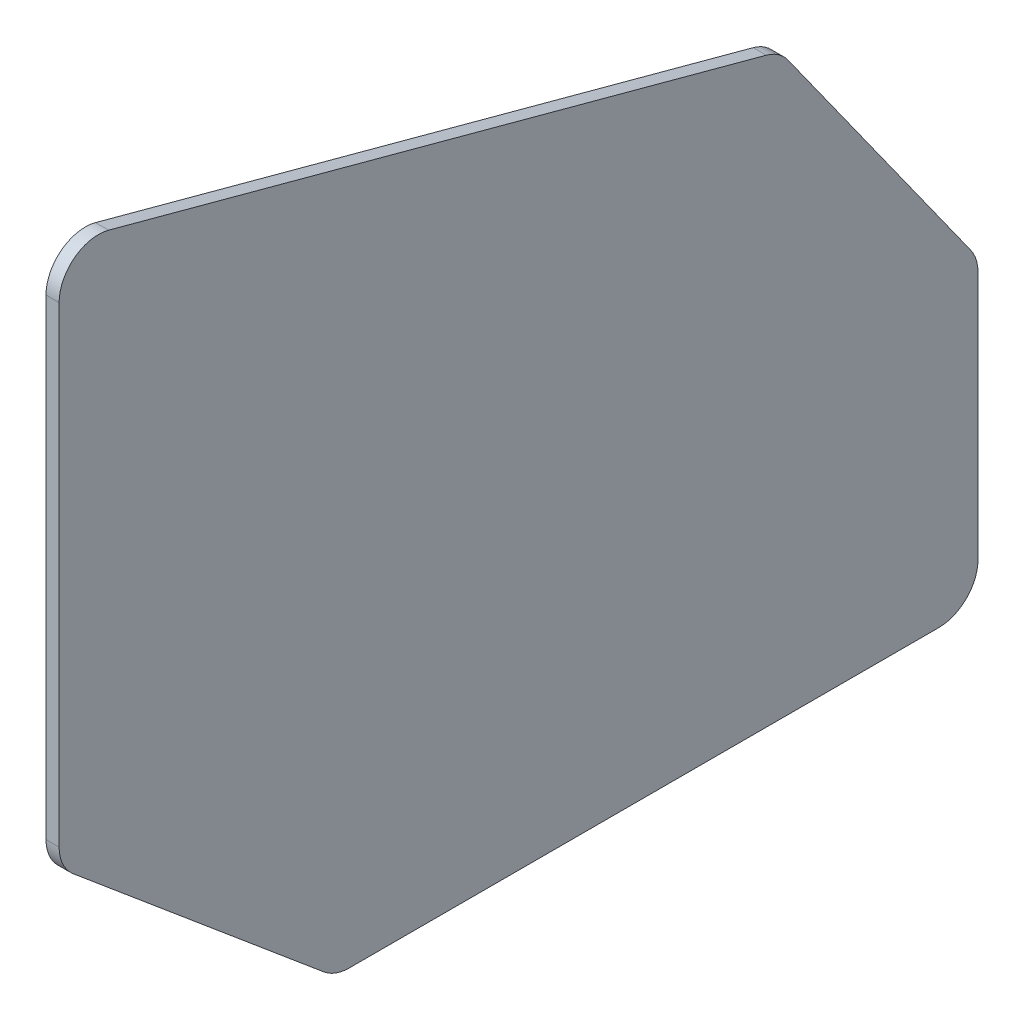
ISO-10303-21;
HEADER;
FILE_DESCRIPTION(('STEP AP214'),'2;1');
FILE_NAME('part.step','',(''),(''),'','','');
FILE_SCHEMA(('AUTOMOTIVE_DESIGN { 1 0 10303 214 1 1 1 1 }'));
ENDSEC;
DATA;
#1=APPLICATION_CONTEXT('core data for automotive mechanical design processes');
#2=APPLICATION_PROTOCOL_DEFINITION('international standard','automotive_design',2000,#1);
#3=PRODUCT_CONTEXT('',#1,'mechanical');
#4=PRODUCT('Part','Part','',(#3));
#5=PRODUCT_RELATED_PRODUCT_CATEGORY('part','',(#4));
#6=PRODUCT_DEFINITION_FORMATION('','',#4);
#7=PRODUCT_DEFINITION_CONTEXT('part definition',#1,'design');
#8=PRODUCT_DEFINITION('design','',#6,#7);
#9=PRODUCT_DEFINITION_SHAPE('','',#8);
#10=(LENGTH_UNIT() NAMED_UNIT(*) SI_UNIT(.MILLI.,.METRE.));
#11=(NAMED_UNIT(*) PLANE_ANGLE_UNIT() SI_UNIT($,.RADIAN.));
#12=(NAMED_UNIT(*) SI_UNIT($,.STERADIAN.) SOLID_ANGLE_UNIT());
#13=UNCERTAINTY_MEASURE_WITH_UNIT(LENGTH_MEASURE(1.E-05),#10,'distance_accuracy_value','');
#14=(GEOMETRIC_REPRESENTATION_CONTEXT(3) GLOBAL_UNCERTAINTY_ASSIGNED_CONTEXT((#13)) GLOBAL_UNIT_ASSIGNED_CONTEXT((#10,
#11,#12)) REPRESENTATION_CONTEXT('',''));
#15=CARTESIAN_POINT('',(0.,0.,0.));
#16=DIRECTION('',(0.,0.,1.));
#17=DIRECTION('',(1.,0.,0.));
#18=AXIS2_PLACEMENT_3D('',#15,#16,#17);
#19=CARTESIAN_POINT('',(10.,-174.517122226006,-532.073894018374));
#20=DIRECTION('',(-1.,0.,0.));
#21=DIRECTION('',(0.,0.,1.));
#22=AXIS2_PLACEMENT_3D('',#19,#20,#21);
#23=CYLINDRICAL_SURFACE('',#22,30.0000000000001);
#24=CARTESIAN_POINT('',(0.,-174.517122226006,-532.073894018374));
#25=DIRECTION('',(1.,0.,0.));
#26=DIRECTION('',(0.,0.,1.));
#27=AXIS2_PLACEMENT_3D('',#24,#25,#26);
#28=CIRCLE('',#27,30.0000000000001);
#29=CARTESIAN_POINT('',(0.,-157.087470130835,-556.491249072542));
#30=VERTEX_POINT('',#29);
#31=CARTESIAN_POINT('',(0.,-145.551320648023,-539.883012979237));
#32=VERTEX_POINT('',#31);
#33=EDGE_CURVE('E402',#30,#32,#28,.T.);
#34=ORIENTED_EDGE('',*,*,#33,.T.);
#35=DIRECTION('',(-1.,0.,0.));
#36=VECTOR('',#35,1.);
#37=CARTESIAN_POINT('',(10.,-145.551320648023,-539.883012979237));
#38=LINE('',#37,#36);
#39=CARTESIAN_POINT('',(10.,-145.551320648023,-539.883012979237));
#40=VERTEX_POINT('',#39);
#41=EDGE_CURVE('E11',#40,#32,#38,.T.);
#42=ORIENTED_EDGE('',*,*,#41,.F.);
#43=CARTESIAN_POINT('',(10.,-174.517122226006,-532.073894018374));
#44=DIRECTION('',(1.,0.,0.));
#45=DIRECTION('',(0.,0.,1.));
#46=AXIS2_PLACEMENT_3D('',#43,#44,#45);
#47=CIRCLE('',#46,30.0000000000001);
#48=CARTESIAN_POINT('',(10.,-157.087470130835,-556.491249072542));
#49=VERTEX_POINT('',#48);
#50=EDGE_CURVE('E442',#49,#40,#47,.T.);
#51=ORIENTED_EDGE('',*,*,#50,.F.);
#52=DIRECTION('',(-1.,0.,0.));
#53=VECTOR('',#52,1.);
#54=CARTESIAN_POINT('',(10.,-157.087470130835,-556.491249072542));
#55=LINE('',#54,#53);
#56=EDGE_CURVE('E443',#49,#30,#55,.T.);
#57=ORIENTED_EDGE('',*,*,#56,.T.);
#58=EDGE_LOOP('',(#34,#42,#51,#57));
#59=FACE_BOUND('',#58,.T.);
#60=ADVANCED_FACE('F39',(#59),#23,.T.);
#61=CARTESIAN_POINT('',(10.,-145.551320648023,-539.883012979237));
#62=DIRECTION('',(0.,-0.965526719266104,0.260303965362101));
#63=DIRECTION('',(0.,-0.260303965362101,-0.965526719266104));
#64=AXIS2_PLACEMENT_3D('',#61,#62,#63);
#65=PLANE('',#64);
#66=DIRECTION('',(0.,0.260303965362101,0.965526719266104));
#67=VECTOR('',#66,1.);
#68=CARTESIAN_POINT('',(0.,-145.551320648023,-539.883012979237));
#69=LINE('',#68,#67);
#70=CARTESIAN_POINT('',(0.,-10.1932586597301,-37.8091189608631));
#71=VERTEX_POINT('',#70);
#72=EDGE_CURVE('E392',#32,#71,#69,.T.);
#73=ORIENTED_EDGE('',*,*,#72,.T.);
#74=DIRECTION('',(-1.,0.,0.));
#75=VECTOR('',#74,1.);
#76=CARTESIAN_POINT('',(10.,-10.1932586597301,-37.8091189608631));
#77=LINE('',#76,#75);
#78=CARTESIAN_POINT('',(10.,-10.1932586597301,-37.8091189608631));
#79=VERTEX_POINT('',#78);
#80=EDGE_CURVE('E47',#79,#71,#77,.T.);
#81=ORIENTED_EDGE('',*,*,#80,.F.);
#82=DIRECTION('',(0.,0.260303965362101,0.965526719266104));
#83=VECTOR('',#82,1.);
#84=CARTESIAN_POINT('',(10.,-145.551320648023,-539.883012979237));
#85=LINE('',#84,#83);
#86=EDGE_CURVE('E492',#40,#79,#85,.T.);
#87=ORIENTED_EDGE('',*,*,#86,.F.);
#88=ORIENTED_EDGE('',*,*,#41,.T.);
#89=EDGE_LOOP('',(#73,#81,#87,#88));
#90=FACE_BOUND('',#89,.T.);
#91=ADVANCED_FACE('F383',(#90),#65,.F.);
#92=CARTESIAN_POINT('',(10.,-39.1590602377132,-30.));
#93=DIRECTION('',(-1.,0.,0.));
#94=DIRECTION('',(0.,0.,1.));
#95=AXIS2_PLACEMENT_3D('',#92,#93,#94);
#96=CYLINDRICAL_SURFACE('',#95,30.);
#97=CARTESIAN_POINT('',(0.,-39.1590602377132,-30.));
#98=DIRECTION('',(1.,0.,0.));
#99=DIRECTION('',(0.,0.,1.));
#100=AXIS2_PLACEMENT_3D('',#97,#98,#99);
#101=CIRCLE('',#100,30.);
#102=CARTESIAN_POINT('',(0.,-39.1590602377132,0.));
#103=VERTEX_POINT('',#102);
#104=EDGE_CURVE('E401',#71,#103,#101,.T.);
#105=ORIENTED_EDGE('',*,*,#104,.T.);
#106=DIRECTION('',(-1.,0.,0.));
#107=VECTOR('',#106,1.);
#108=CARTESIAN_POINT('',(10.,-39.1590602377132,0.));
#109=LINE('',#108,#107);
#110=CARTESIAN_POINT('',(10.,-39.1590602377132,0.));
#111=VERTEX_POINT('',#110);
#112=EDGE_CURVE('E408',#111,#103,#109,.T.);
#113=ORIENTED_EDGE('',*,*,#112,.F.);
#114=CARTESIAN_POINT('',(10.,-39.1590602377132,-30.));
#115=DIRECTION('',(1.,0.,0.));
#116=DIRECTION('',(0.,0.,1.));
#117=AXIS2_PLACEMENT_3D('',#114,#115,#116);
#118=CIRCLE('',#117,30.);
#119=EDGE_CURVE('E406',#79,#111,#118,.T.);
#120=ORIENTED_EDGE('',*,*,#119,.F.);
#121=ORIENTED_EDGE('',*,*,#80,.T.);
#122=EDGE_LOOP('',(#105,#113,#120,#121));
#123=FACE_BOUND('',#122,.T.);
#124=ADVANCED_FACE('F380',(#123),#96,.T.);
#125=CARTESIAN_POINT('',(10.,-39.1590602377132,0.));
#126=DIRECTION('',(0.,0.,-1.));
#127=DIRECTION('',(0.,1.,0.));
#128=AXIS2_PLACEMENT_3D('',#125,#126,#127);
#129=PLANE('',#128);
#130=DIRECTION('',(0.,-1.,0.));
#131=VECTOR('',#130,1.);
#132=CARTESIAN_POINT('',(0.,-39.1590602377132,0.));
#133=LINE('',#132,#131);
#134=CARTESIAN_POINT('',(0.,-399.159060237713,0.));
#135=VERTEX_POINT('',#134);
#136=EDGE_CURVE('E411',#103,#135,#133,.T.);
#137=ORIENTED_EDGE('',*,*,#136,.T.);
#138=DIRECTION('',(-1.,0.,0.));
#139=VECTOR('',#138,1.);
#140=CARTESIAN_POINT('',(10.,-399.159060237713,0.));
#141=LINE('',#140,#139);
#142=CARTESIAN_POINT('',(10.,-399.159060237713,0.));
#143=VERTEX_POINT('',#142);
#144=EDGE_CURVE('E476',#143,#135,#141,.T.);
#145=ORIENTED_EDGE('',*,*,#144,.F.);
#146=DIRECTION('',(0.,-1.,0.));
#147=VECTOR('',#146,1.);
#148=CARTESIAN_POINT('',(10.,-39.1590602377132,0.));
#149=LINE('',#148,#147);
#150=EDGE_CURVE('E483',#111,#143,#149,.T.);
#151=ORIENTED_EDGE('',*,*,#150,.F.);
#152=ORIENTED_EDGE('',*,*,#112,.T.);
#153=EDGE_LOOP('',(#137,#145,#151,#152));
#154=FACE_BOUND('',#153,.T.);
#155=ADVANCED_FACE('F376',(#154),#129,.F.);
#156=CARTESIAN_POINT('',(10.,-399.159060237713,-29.9999999999999));
#157=DIRECTION('',(-1.,0.,0.));
#158=DIRECTION('',(0.,0.,1.));
#159=AXIS2_PLACEMENT_3D('',#156,#157,#158);
#160=CYLINDRICAL_SURFACE('',#159,30.);
#161=CARTESIAN_POINT('',(0.,-399.159060237713,-29.9999999999999));
#162=DIRECTION('',(1.,0.,0.));
#163=DIRECTION('',(0.,0.,1.));
#164=AXIS2_PLACEMENT_3D('',#161,#162,#163);
#165=CIRCLE('',#164,30.);
#166=CARTESIAN_POINT('',(0.,-422.140393531283,-10.7163717094038));
#167=VERTEX_POINT('',#166);
#168=EDGE_CURVE('E415',#135,#167,#165,.T.);
#169=ORIENTED_EDGE('',*,*,#168,.T.);
#170=DIRECTION('',(-1.,0.,0.));
#171=VECTOR('',#170,1.);
#172=CARTESIAN_POINT('',(10.,-422.140393531283,-10.7163717094038));
#173=LINE('',#172,#171);
#174=CARTESIAN_POINT('',(10.,-422.140393531283,-10.7163717094038));
#175=VERTEX_POINT('',#174);
#176=EDGE_CURVE('E472',#175,#167,#173,.T.);
#177=ORIENTED_EDGE('',*,*,#176,.F.);
#178=CARTESIAN_POINT('',(10.,-399.159060237713,-29.9999999999999));
#179=DIRECTION('',(1.,0.,0.));
#180=DIRECTION('',(0.,0.,1.));
#181=AXIS2_PLACEMENT_3D('',#178,#179,#180);
#182=CIRCLE('',#181,30.);
#183=EDGE_CURVE('E486',#143,#175,#182,.T.);
#184=ORIENTED_EDGE('',*,*,#183,.F.);
#185=ORIENTED_EDGE('',*,*,#144,.T.);
#186=EDGE_LOOP('',(#169,#177,#184,#185));
#187=FACE_BOUND('',#186,.T.);
#188=ADVANCED_FACE('F372',(#187),#160,.T.);
#189=CARTESIAN_POINT('',(10.,-422.140393531283,-10.7163717094038));
#190=DIRECTION('',(0.,0.76604444311898,-0.642787609686537));
#191=DIRECTION('',(0.,0.642787609686537,0.76604444311898));
#192=AXIS2_PLACEMENT_3D('',#189,#190,#191);
#193=PLANE('',#192);
#194=DIRECTION('',(0.,-0.642787609686537,-0.76604444311898));
#195=VECTOR('',#194,1.);
#196=CARTESIAN_POINT('',(0.,-422.140393531283,-10.7163717094038));
#197=LINE('',#196,#195);
#198=CARTESIAN_POINT('',(0.,-582.837295952917,-202.227482489149));
#199=VERTEX_POINT('',#198);
#200=EDGE_CURVE('E421',#167,#199,#197,.T.);
#201=ORIENTED_EDGE('',*,*,#200,.T.);
#202=DIRECTION('',(-1.,0.,0.));
#203=VECTOR('',#202,1.);
#204=CARTESIAN_POINT('',(10.,-582.837295952917,-202.227482489149));
#205=LINE('',#204,#203);
#206=CARTESIAN_POINT('',(10.,-582.837295952917,-202.227482489149));
#207=VERTEX_POINT('',#206);
#208=EDGE_CURVE('E468',#207,#199,#205,.T.);
#209=ORIENTED_EDGE('',*,*,#208,.F.);
#210=DIRECTION('',(0.,-0.642787609686537,-0.76604444311898));
#211=VECTOR('',#210,1.);
#212=CARTESIAN_POINT('',(10.,-422.140393531283,-10.7163717094038));
#213=LINE('',#212,#211);
#214=EDGE_CURVE('E490',#175,#207,#213,.T.);
#215=ORIENTED_EDGE('',*,*,#214,.F.);
#216=ORIENTED_EDGE('',*,*,#176,.T.);
#217=EDGE_LOOP('',(#201,#209,#215,#216));
#218=FACE_BOUND('',#217,.T.);
#219=ADVANCED_FACE('F368',(#218),#193,.F.);
#220=CARTESIAN_POINT('',(10.,-559.855962659348,-221.511110779745));
#221=DIRECTION('',(-1.,0.,0.));
#222=DIRECTION('',(0.,0.,1.));
#223=AXIS2_PLACEMENT_3D('',#220,#221,#222);
#224=CYLINDRICAL_SURFACE('',#223,30.);
#225=CARTESIAN_POINT('',(0.,-559.855962659348,-221.511110779745));
#226=DIRECTION('',(1.,0.,0.));
#227=DIRECTION('',(0.,0.,1.));
#228=AXIS2_PLACEMENT_3D('',#225,#226,#227);
#229=CIRCLE('',#228,30.);
#230=CARTESIAN_POINT('',(0.,-589.855962659348,-221.511110779745));
#231=VERTEX_POINT('',#230);
#232=EDGE_CURVE('E424',#199,#231,#229,.T.);
#233=ORIENTED_EDGE('',*,*,#232,.T.);
#234=DIRECTION('',(-1.,0.,0.));
#235=VECTOR('',#234,1.);
#236=CARTESIAN_POINT('',(10.,-589.855962659348,-221.511110779745));
#237=LINE('',#236,#235);
#238=CARTESIAN_POINT('',(10.,-589.855962659348,-221.511110779745));
#239=VERTEX_POINT('',#238);
#240=EDGE_CURVE('E464',#239,#231,#237,.T.);
#241=ORIENTED_EDGE('',*,*,#240,.F.);
#242=CARTESIAN_POINT('',(10.,-559.855962659348,-221.511110779745));
#243=DIRECTION('',(1.,0.,0.));
#244=DIRECTION('',(0.,0.,1.));
#245=AXIS2_PLACEMENT_3D('',#242,#243,#244);
#246=CIRCLE('',#245,30.);
#247=EDGE_CURVE('E498',#207,#239,#246,.T.);
#248=ORIENTED_EDGE('',*,*,#247,.F.);
#249=ORIENTED_EDGE('',*,*,#208,.T.);
#250=EDGE_LOOP('',(#233,#241,#248,#249));
#251=FACE_BOUND('',#250,.T.);
#252=ADVANCED_FACE('F364',(#251),#224,.T.);
#253=CARTESIAN_POINT('',(10.,-589.855962659348,-221.511110779745));
#254=DIRECTION('',(0.,1.,0.));
#255=DIRECTION('',(0.,0.,1.));
#256=AXIS2_PLACEMENT_3D('',#253,#254,#255);
#257=PLANE('',#256);
#258=DIRECTION('',(0.,0.,-1.));
#259=VECTOR('',#258,1.);
#260=CARTESIAN_POINT('',(0.,-589.855962659348,-221.511110779745));
#261=LINE('',#260,#259);
#262=CARTESIAN_POINT('',(0.,-589.855962659348,-671.511110779745));
#263=VERTEX_POINT('',#262);
#264=EDGE_CURVE('E427',#231,#263,#261,.T.);
#265=ORIENTED_EDGE('',*,*,#264,.T.);
#266=DIRECTION('',(-1.,0.,0.));
#267=VECTOR('',#266,1.);
#268=CARTESIAN_POINT('',(10.,-589.855962659348,-671.511110779745));
#269=LINE('',#268,#267);
#270=CARTESIAN_POINT('',(10.,-589.855962659348,-671.511110779745));
#271=VERTEX_POINT('',#270);
#272=EDGE_CURVE('E460',#271,#263,#269,.T.);
#273=ORIENTED_EDGE('',*,*,#272,.F.);
#274=DIRECTION('',(0.,0.,-1.));
#275=VECTOR('',#274,1.);
#276=CARTESIAN_POINT('',(10.,-589.855962659348,-221.511110779745));
#277=LINE('',#276,#275);
#278=EDGE_CURVE('E501',#239,#271,#277,.T.);
#279=ORIENTED_EDGE('',*,*,#278,.F.);
#280=ORIENTED_EDGE('',*,*,#240,.T.);
#281=EDGE_LOOP('',(#265,#273,#279,#280));
#282=FACE_BOUND('',#281,.T.);
#283=ADVANCED_FACE('F360',(#282),#257,.F.);
#284=CARTESIAN_POINT('',(10.,-559.855962659348,-671.511110779745));
#285=DIRECTION('',(-1.,0.,0.));
#286=DIRECTION('',(0.,0.,1.));
#287=AXIS2_PLACEMENT_3D('',#284,#285,#286);
#288=CYLINDRICAL_SURFACE('',#287,30.0000000000001);
#289=CARTESIAN_POINT('',(0.,-559.855962659348,-671.511110779745));
#290=DIRECTION('',(1.,0.,0.));
#291=DIRECTION('',(0.,0.,1.));
#292=AXIS2_PLACEMENT_3D('',#289,#290,#291);
#293=CIRCLE('',#292,30.0000000000001);
#294=CARTESIAN_POINT('',(0.,-559.855962659348,-701.511110779745));
#295=VERTEX_POINT('',#294);
#296=EDGE_CURVE('E430',#263,#295,#293,.T.);
#297=ORIENTED_EDGE('',*,*,#296,.T.);
#298=DIRECTION('',(-1.,0.,0.));
#299=VECTOR('',#298,1.);
#300=CARTESIAN_POINT('',(10.,-559.855962659348,-701.511110779745));
#301=LINE('',#300,#299);
#302=CARTESIAN_POINT('',(10.,-559.855962659348,-701.511110779745));
#303=VERTEX_POINT('',#302);
#304=EDGE_CURVE('E456',#303,#295,#301,.T.);
#305=ORIENTED_EDGE('',*,*,#304,.F.);
#306=CARTESIAN_POINT('',(10.,-559.855962659348,-671.511110779745));
#307=DIRECTION('',(1.,0.,0.));
#308=DIRECTION('',(0.,0.,1.));
#309=AXIS2_PLACEMENT_3D('',#306,#307,#308);
#310=CIRCLE('',#309,30.0000000000001);
#311=EDGE_CURVE('E504',#271,#303,#310,.T.);
#312=ORIENTED_EDGE('',*,*,#311,.F.);
#313=ORIENTED_EDGE('',*,*,#272,.T.);
#314=EDGE_LOOP('',(#297,#305,#312,#313));
#315=FACE_BOUND('',#314,.T.);
#316=ADVANCED_FACE('F356',(#315),#288,.T.);
#317=CARTESIAN_POINT('',(10.,-559.855962659348,-701.511110779745));
#318=DIRECTION('',(0.,0.,1.));
#319=DIRECTION('',(0.,-1.,0.));
#320=AXIS2_PLACEMENT_3D('',#317,#318,#319);
#321=PLANE('',#320);
#322=DIRECTION('',(0.,1.,0.));
#323=VECTOR('',#322,1.);
#324=CARTESIAN_POINT('',(0.,-559.855962659348,-701.511110779745));
#325=LINE('',#324,#323);
#326=CARTESIAN_POINT('',(0.,-369.855962659348,-701.511110779745));
#327=VERTEX_POINT('',#326);
#328=EDGE_CURVE('E433',#295,#327,#325,.T.);
#329=ORIENTED_EDGE('',*,*,#328,.T.);
#330=DIRECTION('',(-1.,0.,0.));
#331=VECTOR('',#330,1.);
#332=CARTESIAN_POINT('',(10.,-369.855962659348,-701.511110779745));
#333=LINE('',#332,#331);
#334=CARTESIAN_POINT('',(10.,-369.855962659348,-701.511110779745));
#335=VERTEX_POINT('',#334);
#336=EDGE_CURVE('E452',#335,#327,#333,.T.);
#337=ORIENTED_EDGE('',*,*,#336,.F.);
#338=DIRECTION('',(0.,1.,0.));
#339=VECTOR('',#338,1.);
#340=CARTESIAN_POINT('',(10.,-559.855962659348,-701.511110779745));
#341=LINE('',#340,#339);
#342=EDGE_CURVE('E507',#303,#335,#341,.T.);
#343=ORIENTED_EDGE('',*,*,#342,.F.);
#344=ORIENTED_EDGE('',*,*,#304,.T.);
#345=EDGE_LOOP('',(#329,#337,#343,#344));
#346=FACE_BOUND('',#345,.T.);
#347=ADVANCED_FACE('F352',(#346),#321,.F.);
#348=CARTESIAN_POINT('',(10.,-369.855962659348,-671.511110779745));
#349=DIRECTION('',(-1.,0.,0.));
#350=DIRECTION('',(0.,0.,1.));
#351=AXIS2_PLACEMENT_3D('',#348,#349,#350);
#352=CYLINDRICAL_SURFACE('',#351,30.);
#353=CARTESIAN_POINT('',(0.,-369.855962659348,-671.511110779745));
#354=DIRECTION('',(1.,0.,0.));
#355=DIRECTION('',(0.,0.,1.));
#356=AXIS2_PLACEMENT_3D('',#353,#354,#355);
#357=CIRCLE('',#356,30.);
#358=CARTESIAN_POINT('',(0.,-352.426310564176,-695.928465833913));
#359=VERTEX_POINT('',#358);
#360=EDGE_CURVE('E436',#327,#359,#357,.T.);
#361=ORIENTED_EDGE('',*,*,#360,.T.);
#362=DIRECTION('',(-1.,0.,0.));
#363=VECTOR('',#362,1.);
#364=CARTESIAN_POINT('',(10.,-352.426310564176,-695.928465833913));
#365=LINE('',#364,#363);
#366=CARTESIAN_POINT('',(10.,-352.426310564176,-695.928465833913));
#367=VERTEX_POINT('',#366);
#368=EDGE_CURVE('E447',#367,#359,#365,.T.);
#369=ORIENTED_EDGE('',*,*,#368,.F.);
#370=CARTESIAN_POINT('',(10.,-369.855962659348,-671.511110779745));
#371=DIRECTION('',(1.,0.,0.));
#372=DIRECTION('',(0.,0.,1.));
#373=AXIS2_PLACEMENT_3D('',#370,#371,#372);
#374=CIRCLE('',#373,30.);
#375=EDGE_CURVE('E510',#335,#367,#374,.T.);
#376=ORIENTED_EDGE('',*,*,#375,.F.);
#377=ORIENTED_EDGE('',*,*,#336,.T.);
#378=EDGE_LOOP('',(#361,#369,#376,#377));
#379=FACE_BOUND('',#378,.T.);
#380=ADVANCED_FACE('F348',(#379),#352,.T.);
#381=CARTESIAN_POINT('',(10.,-352.426310564176,-695.928465833913));
#382=DIRECTION('',(0.,-0.580988403172377,0.813911835138924));
#383=DIRECTION('',(0.,-0.813911835138924,-0.580988403172377));
#384=AXIS2_PLACEMENT_3D('',#381,#382,#383);
#385=PLANE('',#384);
#386=DIRECTION('',(0.,0.813911835138924,0.580988403172377));
#387=VECTOR('',#386,1.);
#388=CARTESIAN_POINT('',(0.,-352.426310564176,-695.928465833913));
#389=LINE('',#388,#387);
#390=EDGE_CURVE('E439',#359,#30,#389,.T.);
#391=ORIENTED_EDGE('',*,*,#390,.T.);
#392=ORIENTED_EDGE('',*,*,#56,.F.);
#393=DIRECTION('',(0.,0.813911835138924,0.580988403172377));
#394=VECTOR('',#393,1.);
#395=CARTESIAN_POINT('',(10.,-352.426310564176,-695.928465833913));
#396=LINE('',#395,#394);
#397=EDGE_CURVE('E448',#367,#49,#396,.T.);
#398=ORIENTED_EDGE('',*,*,#397,.F.);
#399=ORIENTED_EDGE('',*,*,#368,.T.);
#400=EDGE_LOOP('',(#391,#392,#398,#399));
#401=FACE_BOUND('',#400,.T.);
#402=ADVANCED_FACE('F341',(#401),#385,.F.);
#403=CARTESIAN_POINT('',(10.,-174.517122226006,-532.073894018374));
#404=DIRECTION('',(-1.,0.,0.));
#405=DIRECTION('',(0.,0.,1.));
#406=AXIS2_PLACEMENT_3D('',#403,#404,#405);
#407=PLANE('',#406);
#408=ORIENTED_EDGE('',*,*,#50,.T.);
#409=ORIENTED_EDGE('',*,*,#86,.T.);
#410=ORIENTED_EDGE('',*,*,#119,.T.);
#411=ORIENTED_EDGE('',*,*,#150,.T.);
#412=ORIENTED_EDGE('',*,*,#183,.T.);
#413=ORIENTED_EDGE('',*,*,#214,.T.);
#414=ORIENTED_EDGE('',*,*,#247,.T.);
#415=ORIENTED_EDGE('',*,*,#278,.T.);
#416=ORIENTED_EDGE('',*,*,#311,.T.);
#417=ORIENTED_EDGE('',*,*,#342,.T.);
#418=ORIENTED_EDGE('',*,*,#375,.T.);
#419=ORIENTED_EDGE('',*,*,#397,.T.);
#420=EDGE_LOOP('',(#408,#409,#410,#411,#412,#413,#414,#415,#416,#417,#418,#419));
#421=FACE_BOUND('',#420,.T.);
#422=ADVANCED_FACE('F338',(#421),#407,.F.);
#423=CARTESIAN_POINT('',(0.,-174.517122226006,-532.073894018374));
#424=DIRECTION('',(-1.,0.,0.));
#425=DIRECTION('',(0.,0.,1.));
#426=AXIS2_PLACEMENT_3D('',#423,#424,#425);
#427=PLANE('',#426);
#428=CARTESIAN_POINT('',(0.,-327.560917885921,-42.3962176752514));
#429=CARTESIAN_POINT('',(0.,-434.657283692067,-179.998241323893));
#430=CARTESIAN_POINT('',(0.,-510.067463813898,-369.496171973337));
#431=CARTESIAN_POINT('',(0.,-482.27942538639,-572.427382244999));
#432=CARTESIAN_POINT('',(0.,-475.947865393782,-626.364411935255));
#433=B_SPLINE_CURVE_WITH_KNOTS('',3,(#428,#429,#430,#431,#432),.UNSPECIFIED.,.F.,.F.,(4,1,4),
(0.,0.742688992902619,1.),.UNSPECIFIED.);
#434=CARTESIAN_POINT('',(0.,-327.560917885921,-42.3962176752514));
#435=VERTEX_POINT('',#434);
#436=CARTESIAN_POINT('',(0.,-475.947865393782,-626.364411935255));
#437=VERTEX_POINT('',#436);
#438=EDGE_CURVE('E54',#435,#437,#433,.T.);
#439=ORIENTED_EDGE('',*,*,#438,.F.);
#440=CARTESIAN_POINT('',(0.,-332.821595277872,-38.3018052864112));
#441=DIRECTION('',(-1.,0.,0.));
#442=DIRECTION('',(0.,0.,1.));
#443=AXIS2_PLACEMENT_3D('',#440,#441,#442);
#444=CIRCLE('',#443,6.66625377795279);
#445=CARTESIAN_POINT('',(0.,-327.560917885921,-34.2073928975711));
#446=VERTEX_POINT('',#445);
#447=EDGE_CURVE('E295',#446,#435,#444,.T.);
#448=ORIENTED_EDGE('',*,*,#447,.F.);
#449=CARTESIAN_POINT('',(0.,-523.626722446305,-646.133694127765));
#450=CARTESIAN_POINT('',(0.,-544.090123726999,-620.26520039731));
#451=CARTESIAN_POINT('',(0.,-589.015611508738,-324.808789115096));
#452=CARTESIAN_POINT('',(0.,-342.918185901168,-14.4757134824387));
#453=CARTESIAN_POINT('',(0.,-327.560917885921,-34.2073928975711));
#454=B_SPLINE_CURVE_WITH_KNOTS('',3,(#449,#450,#451,#452,#453),.UNSPECIFIED.,.F.,.F.,(4,1,4),
(0.,0.454280693006066,1.),.UNSPECIFIED.);
#455=CARTESIAN_POINT('',(0.,-523.626722446305,-646.133694127765));
#456=VERTEX_POINT('',#455);
#457=EDGE_CURVE('E289',#456,#446,#454,.T.);
#458=ORIENTED_EDGE('',*,*,#457,.F.);
#459=CARTESIAN_POINT('',(0.,-502.589093221436,-629.491772363447));
#460=DIRECTION('',(-1.,0.,0.));
#461=DIRECTION('',(0.,0.,1.));
#462=AXIS2_PLACEMENT_3D('',#459,#460,#461);
#463=CIRCLE('',#462,26.8241570867148);
#464=EDGE_CURVE('E281',#437,#456,#463,.T.);
#465=ORIENTED_EDGE('',*,*,#464,.F.);
#466=EDGE_LOOP('',(#439,#448,#458,#465));
#467=FACE_BOUND('',#466,.T.);
#468=CARTESIAN_POINT('',(0.,-208.284508838147,-74.2027651924913));
#469=CARTESIAN_POINT('',(0.,-214.924232146977,-81.1492318782514));
#470=CARTESIAN_POINT('',(0.,-369.790908175434,-316.076431581436));
#471=CARTESIAN_POINT('',(0.,-357.109499900645,-526.742508557986));
#472=CARTESIAN_POINT('',(0.,-348.175125637554,-567.085033992223));
#473=B_SPLINE_CURVE_WITH_KNOTS('',3,(#468,#469,#470,#471,#472),.UNSPECIFIED.,.F.,.F.,(4,1,4),
(0.,0.768435056901998,1.),.UNSPECIFIED.);
#474=CARTESIAN_POINT('',(0.,-208.284508838147,-74.2027651924913));
#475=VERTEX_POINT('',#474);
#476=CARTESIAN_POINT('',(0.,-348.175125637554,-567.085033992223));
#477=VERTEX_POINT('',#476);
#478=EDGE_CURVE('E62',#475,#477,#473,.T.);
#479=ORIENTED_EDGE('',*,*,#478,.F.);
#480=CARTESIAN_POINT('',(0.,-212.017093403613,-70.6350047953519));
#481=DIRECTION('',(-1.,0.,0.));
#482=DIRECTION('',(0.,0.,1.));
#483=AXIS2_PLACEMENT_3D('',#480,#481,#482);
#484=CIRCLE('',#483,5.16343894993929);
#485=CARTESIAN_POINT('',(0.,-215.359019498053,-66.6989367358474));
#486=VERTEX_POINT('',#485);
#487=EDGE_CURVE('E223',#486,#475,#484,.T.);
#488=ORIENTED_EDGE('',*,*,#487,.F.);
#489=CARTESIAN_POINT('',(0.,-393.526935767269,-577.755509270889));
#490=CARTESIAN_POINT('',(0.,-410.500517765273,-509.639726303154));
#491=CARTESIAN_POINT('',(0.,-390.035120939274,-300.322217314818));
#492=CARTESIAN_POINT('',(0.,-254.957400327833,-100.32001751799));
#493=CARTESIAN_POINT('',(0.,-215.359019498053,-66.6989367358474));
#494=B_SPLINE_CURVE_WITH_KNOTS('',3,(#489,#490,#491,#492,#493),.UNSPECIFIED.,.F.,.F.,(4,1,4),
(0.,0.345289595398951,1.),.UNSPECIFIED.);
#495=CARTESIAN_POINT('',(0.,-393.526935767269,-577.755509270889));
#496=VERTEX_POINT('',#495);
#497=EDGE_CURVE('E227',#496,#486,#494,.T.);
#498=ORIENTED_EDGE('',*,*,#497,.F.);
#499=CARTESIAN_POINT('',(0.,-370.921108440947,-572.122426202053));
#500=DIRECTION('',(-1.,0.,0.));
#501=DIRECTION('',(0.,0.,1.));
#502=AXIS2_PLACEMENT_3D('',#499,#500,#501);
#503=CIRCLE('',#502,23.2971039824244);
#504=EDGE_CURVE('E731',#477,#496,#503,.T.);
#505=ORIENTED_EDGE('',*,*,#504,.F.);
#506=EDGE_LOOP('',(#479,#488,#498,#505));
#507=FACE_BOUND('',#506,.T.);
#508=CARTESIAN_POINT('',(0.,-93.9889301215881,-98.8291468053997));
#509=CARTESIAN_POINT('',(0.,-114.882858950243,-112.622758483207));
#510=CARTESIAN_POINT('',(0.,-182.137837809804,-192.730208887923));
#511=CARTESIAN_POINT('',(0.,-194.688304583207,-300.184384568456));
#512=CARTESIAN_POINT('',(0.,-194.685467652383,-331.179728440837));
#513=B_SPLINE_CURVE_WITH_KNOTS('',3,(#508,#509,#510,#511,#512),.UNSPECIFIED.,.F.,.F.,(4,1,4),
(0.,0.660882751637331,1.),.UNSPECIFIED.);
#514=CARTESIAN_POINT('',(0.,-93.9889301215881,-98.8291468053997));
#515=VERTEX_POINT('',#514);
#516=CARTESIAN_POINT('',(0.,-194.685467652383,-331.179728440837));
#517=VERTEX_POINT('',#516);
#518=EDGE_CURVE('E306',#515,#517,#513,.T.);
#519=ORIENTED_EDGE('',*,*,#518,.F.);
#520=CARTESIAN_POINT('',(0.,-96.1610640225741,-95.5388982328283));
#521=DIRECTION('',(-1.,0.,0.));
#522=DIRECTION('',(0.,0.,1.));
#523=AXIS2_PLACEMENT_3D('',#520,#521,#522);
#524=CIRCLE('',#523,3.94257547208935);
#525=CARTESIAN_POINT('',(0.,-98.1982205957029,-92.1634139046647));
#526=VERTEX_POINT('',#525);
#527=EDGE_CURVE('E323',#526,#515,#524,.T.);
#528=ORIENTED_EDGE('',*,*,#527,.F.);
#529=CARTESIAN_POINT('',(0.,-215.359019498053,-332.693478173995));
#530=CARTESIAN_POINT('',(0.,-215.472572373608,-331.921739282793));
#531=CARTESIAN_POINT('',(0.,-224.562098264763,-226.918714052244));
#532=CARTESIAN_POINT('',(0.,-154.802617957198,-126.325036043108));
#533=CARTESIAN_POINT('',(0.,-98.1982205957029,-92.1634139046647));
#534=B_SPLINE_CURVE_WITH_KNOTS('',3,(#529,#530,#531,#532,#533),.UNSPECIFIED.,.F.,.F.,(4,1,4),
(0.,0.354260741323689,1.),.UNSPECIFIED.);
#535=CARTESIAN_POINT('',(0.,-215.359019498053,-332.693478173995));
#536=VERTEX_POINT('',#535);
#537=EDGE_CURVE('E585',#536,#526,#534,.T.);
#538=ORIENTED_EDGE('',*,*,#537,.F.);
#539=CARTESIAN_POINT('',(0.,-205.077593488352,-331.180679607639));
#540=DIRECTION('',(-1.,0.,0.));
#541=DIRECTION('',(0.,0.,1.));
#542=AXIS2_PLACEMENT_3D('',#539,#540,#541);
#543=CIRCLE('',#542,10.3921258794981);
#544=EDGE_CURVE('E580',#517,#536,#543,.T.);
#545=ORIENTED_EDGE('',*,*,#544,.F.);
#546=EDGE_LOOP('',(#519,#528,#538,#545));
#547=FACE_BOUND('',#546,.T.);
#548=ORIENTED_EDGE('',*,*,#33,.F.);
#549=ORIENTED_EDGE('',*,*,#390,.F.);
#550=ORIENTED_EDGE('',*,*,#360,.F.);
#551=ORIENTED_EDGE('',*,*,#328,.F.);
#552=ORIENTED_EDGE('',*,*,#296,.F.);
#553=ORIENTED_EDGE('',*,*,#264,.F.);
#554=ORIENTED_EDGE('',*,*,#232,.F.);
#555=ORIENTED_EDGE('',*,*,#200,.F.);
#556=ORIENTED_EDGE('',*,*,#168,.F.);
#557=ORIENTED_EDGE('',*,*,#136,.F.);
#558=ORIENTED_EDGE('',*,*,#104,.F.);
#559=ORIENTED_EDGE('',*,*,#72,.F.);
#560=EDGE_LOOP('',(#548,#549,#550,#551,#552,#553,#554,#555,#556,#557,#558,#559));
#561=FACE_BOUND('',#560,.T.);
#562=ADVANCED_FACE('F334',(#467,#507,#547,#561),#427,.T.);
#563=CARTESIAN_POINT('',(7.,-93.9889301215881,-98.8291468053997));
#564=CARTESIAN_POINT('',(7.,-114.882858950243,-112.622758483207));
#565=CARTESIAN_POINT('',(7.,-182.137837809804,-192.730208887923));
#566=CARTESIAN_POINT('',(7.,-194.688304583207,-300.184384568456));
#567=CARTESIAN_POINT('',(7.,-194.685467652383,-331.179728440837));
#568=B_SPLINE_CURVE_WITH_KNOTS('',3,(#563,#564,#565,#566,#567),.UNSPECIFIED.,.F.,.F.,(4,1,4),
(0.,0.660882751637331,1.),.UNSPECIFIED.);
#569=DIRECTION('',(-1.,0.,0.));
#570=VECTOR('',#569,1.);
#571=SURFACE_OF_LINEAR_EXTRUSION('',#568,#570);
#572=ORIENTED_EDGE('',*,*,#518,.T.);
#573=DIRECTION('',(-1.,0.,0.));
#574=VECTOR('',#573,1.);
#575=CARTESIAN_POINT('',(7.,-194.685467652383,-331.179728440837));
#576=LINE('',#575,#574);
#577=CARTESIAN_POINT('',(7.,-194.685467652383,-331.179728440837));
#578=VERTEX_POINT('',#577);
#579=EDGE_CURVE('E529',#578,#517,#576,.T.);
#580=ORIENTED_EDGE('',*,*,#579,.F.);
#581=CARTESIAN_POINT('',(7.,-93.9889301215881,-98.8291468053997));
#582=VERTEX_POINT('',#581);
#583=EDGE_CURVE('E315',#582,#578,#568,.T.);
#584=ORIENTED_EDGE('',*,*,#583,.F.);
#585=DIRECTION('',(-1.,0.,0.));
#586=VECTOR('',#585,1.);
#587=CARTESIAN_POINT('',(7.,-93.9889301215881,-98.8291468053997));
#588=LINE('',#587,#586);
#589=EDGE_CURVE('E515',#582,#515,#588,.T.);
#590=ORIENTED_EDGE('',*,*,#589,.T.);
#591=EDGE_LOOP('',(#572,#580,#584,#590));
#592=FACE_BOUND('',#591,.T.);
#593=ADVANCED_FACE('F329',(#592),#571,.F.);
#594=CARTESIAN_POINT('',(7.,-96.1610640225741,-95.5388982328283));
#595=DIRECTION('',(-1.,0.,0.));
#596=DIRECTION('',(0.,0.,1.));
#597=AXIS2_PLACEMENT_3D('',#594,#595,#596);
#598=CYLINDRICAL_SURFACE('',#597,3.94257547208935);
#599=ORIENTED_EDGE('',*,*,#527,.T.);
#600=ORIENTED_EDGE('',*,*,#589,.F.);
#601=CARTESIAN_POINT('',(7.,-96.1610640225741,-95.5388982328283));
#602=DIRECTION('',(-1.,0.,0.));
#603=DIRECTION('',(0.,0.,1.));
#604=AXIS2_PLACEMENT_3D('',#601,#602,#603);
#605=CIRCLE('',#604,3.94257547208935);
#606=CARTESIAN_POINT('',(7.,-98.1982205957029,-92.1634139046647));
#607=VERTEX_POINT('',#606);
#608=EDGE_CURVE('E533',#607,#582,#605,.T.);
#609=ORIENTED_EDGE('',*,*,#608,.F.);
#610=DIRECTION('',(-1.,0.,0.));
#611=VECTOR('',#610,1.);
#612=CARTESIAN_POINT('',(7.,-98.1982205957029,-92.1634139046647));
#613=LINE('',#612,#611);
#614=EDGE_CURVE('E517',#607,#526,#613,.T.);
#615=ORIENTED_EDGE('',*,*,#614,.T.);
#616=EDGE_LOOP('',(#599,#600,#609,#615));
#617=FACE_BOUND('',#616,.T.);
#618=ADVANCED_FACE('F333',(#617),#598,.F.);
#619=CARTESIAN_POINT('',(7.,-215.359019498053,-332.693478173995));
#620=CARTESIAN_POINT('',(7.,-215.472572373608,-331.921739282793));
#621=CARTESIAN_POINT('',(7.,-224.562098264763,-226.918714052244));
#622=CARTESIAN_POINT('',(7.,-154.802617957198,-126.325036043108));
#623=CARTESIAN_POINT('',(7.,-98.1982205957029,-92.1634139046647));
#624=B_SPLINE_CURVE_WITH_KNOTS('',3,(#619,#620,#621,#622,#623),.UNSPECIFIED.,.F.,.F.,(4,1,4),
(0.,0.354260741323689,1.),.UNSPECIFIED.);
#625=DIRECTION('',(-1.,0.,0.));
#626=VECTOR('',#625,1.);
#627=SURFACE_OF_LINEAR_EXTRUSION('',#624,#626);
#628=ORIENTED_EDGE('',*,*,#537,.T.);
#629=ORIENTED_EDGE('',*,*,#614,.F.);
#630=CARTESIAN_POINT('',(7.,-215.359019498053,-332.693478173995));
#631=VERTEX_POINT('',#630);
#632=EDGE_CURVE('E566',#631,#607,#624,.T.);
#633=ORIENTED_EDGE('',*,*,#632,.F.);
#634=DIRECTION('',(-1.,0.,0.));
#635=VECTOR('',#634,1.);
#636=CARTESIAN_POINT('',(7.,-215.359019498053,-332.693478173995));
#637=LINE('',#636,#635);
#638=EDGE_CURVE('E522',#631,#536,#637,.T.);
#639=ORIENTED_EDGE('',*,*,#638,.T.);
#640=EDGE_LOOP('',(#628,#629,#633,#639));
#641=FACE_BOUND('',#640,.T.);
#642=ADVANCED_FACE('F608',(#641),#627,.F.);
#643=CARTESIAN_POINT('',(7.,-205.077593488352,-331.180679607639));
#644=DIRECTION('',(-1.,0.,0.));
#645=DIRECTION('',(0.,0.,1.));
#646=AXIS2_PLACEMENT_3D('',#643,#644,#645);
#647=CYLINDRICAL_SURFACE('',#646,10.3921258794981);
#648=ORIENTED_EDGE('',*,*,#544,.T.);
#649=ORIENTED_EDGE('',*,*,#638,.F.);
#650=CARTESIAN_POINT('',(7.,-205.077593488352,-331.180679607639));
#651=DIRECTION('',(-1.,0.,0.));
#652=DIRECTION('',(0.,0.,1.));
#653=AXIS2_PLACEMENT_3D('',#650,#651,#652);
#654=CIRCLE('',#653,10.3921258794981);
#655=EDGE_CURVE('E322',#578,#631,#654,.T.);
#656=ORIENTED_EDGE('',*,*,#655,.F.);
#657=ORIENTED_EDGE('',*,*,#579,.T.);
#658=EDGE_LOOP('',(#648,#649,#656,#657));
#659=FACE_BOUND('',#658,.T.);
#660=ADVANCED_FACE('F336',(#659),#647,.F.);
#661=CARTESIAN_POINT('',(7.,-161.310600978169,-185.579449198763));
#662=DIRECTION('',(-1.,0.,0.));
#663=DIRECTION('',(0.,0.,1.));
#664=AXIS2_PLACEMENT_3D('',#661,#662,#663);
#665=PLANE('',#664);
#666=ORIENTED_EDGE('',*,*,#583,.T.);
#667=ORIENTED_EDGE('',*,*,#655,.T.);
#668=ORIENTED_EDGE('',*,*,#632,.T.);
#669=ORIENTED_EDGE('',*,*,#608,.T.);
#670=EDGE_LOOP('',(#666,#667,#668,#669));
#671=FACE_BOUND('',#670,.T.);
#672=ADVANCED_FACE('F241',(#671),#665,.T.);
#673=CARTESIAN_POINT('',(7.,-208.284508838147,-74.2027651924913));
#674=CARTESIAN_POINT('',(7.,-214.924232146977,-81.1492318782514));
#675=CARTESIAN_POINT('',(7.,-369.790908175434,-316.076431581436));
#676=CARTESIAN_POINT('',(7.,-357.109499900645,-526.742508557986));
#677=CARTESIAN_POINT('',(7.,-348.175125637554,-567.085033992223));
#678=B_SPLINE_CURVE_WITH_KNOTS('',3,(#673,#674,#675,#676,#677),.UNSPECIFIED.,.F.,.F.,(4,1,4),
(0.,0.768435056901998,1.),.UNSPECIFIED.);
#679=DIRECTION('',(-1.,0.,0.));
#680=VECTOR('',#679,1.);
#681=SURFACE_OF_LINEAR_EXTRUSION('',#678,#680);
#682=ORIENTED_EDGE('',*,*,#478,.T.);
#683=DIRECTION('',(-1.,0.,0.));
#684=VECTOR('',#683,1.);
#685=CARTESIAN_POINT('',(7.,-348.175125637554,-567.085033992223));
#686=LINE('',#685,#684);
#687=CARTESIAN_POINT('',(7.,-348.175125637554,-567.085033992223));
#688=VERTEX_POINT('',#687);
#689=EDGE_CURVE('E198',#688,#477,#686,.T.);
#690=ORIENTED_EDGE('',*,*,#689,.F.);
#691=CARTESIAN_POINT('',(7.,-208.284508838147,-74.2027651924913));
#692=VERTEX_POINT('',#691);
#693=EDGE_CURVE('E202',#692,#688,#678,.T.);
#694=ORIENTED_EDGE('',*,*,#693,.F.);
#695=DIRECTION('',(-1.,0.,0.));
#696=VECTOR('',#695,1.);
#697=CARTESIAN_POINT('',(7.,-208.284508838147,-74.2027651924913));
#698=LINE('',#697,#696);
#699=EDGE_CURVE('E282',#692,#475,#698,.T.);
#700=ORIENTED_EDGE('',*,*,#699,.T.);
#701=EDGE_LOOP('',(#682,#690,#694,#700));
#702=FACE_BOUND('',#701,.T.);
#703=ADVANCED_FACE('F200',(#702),#681,.F.);
#704=CARTESIAN_POINT('',(7.,-212.017093403613,-70.6350047953519));
#705=DIRECTION('',(-1.,0.,0.));
#706=DIRECTION('',(0.,0.,1.));
#707=AXIS2_PLACEMENT_3D('',#704,#705,#706);
#708=CYLINDRICAL_SURFACE('',#707,5.16343894993929);
#709=ORIENTED_EDGE('',*,*,#487,.T.);
#710=ORIENTED_EDGE('',*,*,#699,.F.);
#711=CARTESIAN_POINT('',(7.,-212.017093403613,-70.6350047953519));
#712=DIRECTION('',(-1.,0.,0.));
#713=DIRECTION('',(0.,0.,1.));
#714=AXIS2_PLACEMENT_3D('',#711,#712,#713);
#715=CIRCLE('',#714,5.16343894993929);
#716=CARTESIAN_POINT('',(7.,-215.359019498053,-66.6989367358474));
#717=VERTEX_POINT('',#716);
#718=EDGE_CURVE('E209',#717,#692,#715,.T.);
#719=ORIENTED_EDGE('',*,*,#718,.F.);
#720=DIRECTION('',(-1.,0.,0.));
#721=VECTOR('',#720,1.);
#722=CARTESIAN_POINT('',(7.,-215.359019498053,-66.6989367358474));
#723=LINE('',#722,#721);
#724=EDGE_CURVE('E721',#717,#486,#723,.T.);
#725=ORIENTED_EDGE('',*,*,#724,.T.);
#726=EDGE_LOOP('',(#709,#710,#719,#725));
#727=FACE_BOUND('',#726,.T.);
#728=ADVANCED_FACE('F240',(#727),#708,.F.);
#729=CARTESIAN_POINT('',(7.,-393.526935767269,-577.755509270889));
#730=CARTESIAN_POINT('',(7.,-410.500517765273,-509.639726303154));
#731=CARTESIAN_POINT('',(7.,-390.035120939274,-300.322217314818));
#732=CARTESIAN_POINT('',(7.,-254.957400327833,-100.32001751799));
#733=CARTESIAN_POINT('',(7.,-215.359019498053,-66.6989367358474));
#734=B_SPLINE_CURVE_WITH_KNOTS('',3,(#729,#730,#731,#732,#733),.UNSPECIFIED.,.F.,.F.,(4,1,4),
(0.,0.345289595398951,1.),.UNSPECIFIED.);
#735=DIRECTION('',(-1.,0.,0.));
#736=VECTOR('',#735,1.);
#737=SURFACE_OF_LINEAR_EXTRUSION('',#734,#736);
#738=ORIENTED_EDGE('',*,*,#497,.T.);
#739=ORIENTED_EDGE('',*,*,#724,.F.);
#740=CARTESIAN_POINT('',(7.,-393.526935767269,-577.755509270889));
#741=VERTEX_POINT('',#740);
#742=EDGE_CURVE('E218',#741,#717,#734,.T.);
#743=ORIENTED_EDGE('',*,*,#742,.F.);
#744=DIRECTION('',(-1.,0.,0.));
#745=VECTOR('',#744,1.);
#746=CARTESIAN_POINT('',(7.,-393.526935767269,-577.755509270889));
#747=LINE('',#746,#745);
#748=EDGE_CURVE('E208',#741,#496,#747,.T.);
#749=ORIENTED_EDGE('',*,*,#748,.T.);
#750=EDGE_LOOP('',(#738,#739,#743,#749));
#751=FACE_BOUND('',#750,.T.);
#752=ADVANCED_FACE('F639',(#751),#737,.F.);
#753=CARTESIAN_POINT('',(7.,-370.921108440947,-572.122426202053));
#754=DIRECTION('',(-1.,0.,0.));
#755=DIRECTION('',(0.,0.,1.));
#756=AXIS2_PLACEMENT_3D('',#753,#754,#755);
#757=CYLINDRICAL_SURFACE('',#756,23.2971039824244);
#758=ORIENTED_EDGE('',*,*,#504,.T.);
#759=ORIENTED_EDGE('',*,*,#748,.F.);
#760=CARTESIAN_POINT('',(7.,-370.921108440947,-572.122426202053));
#761=DIRECTION('',(-1.,0.,0.));
#762=DIRECTION('',(0.,0.,1.));
#763=AXIS2_PLACEMENT_3D('',#760,#761,#762);
#764=CIRCLE('',#763,23.2971039824244);
#765=EDGE_CURVE('E212',#688,#741,#764,.T.);
#766=ORIENTED_EDGE('',*,*,#765,.F.);
#767=ORIENTED_EDGE('',*,*,#689,.T.);
#768=EDGE_LOOP('',(#758,#759,#766,#767));
#769=FACE_BOUND('',#768,.T.);
#770=ADVANCED_FACE('F213',(#769),#757,.F.);
#771=CARTESIAN_POINT('',(7.,-305.754426339597,-256.466602508496));
#772=DIRECTION('',(-1.,0.,0.));
#773=DIRECTION('',(0.,0.,1.));
#774=AXIS2_PLACEMENT_3D('',#771,#772,#773);
#775=PLANE('',#774);
#776=ORIENTED_EDGE('',*,*,#693,.T.);
#777=ORIENTED_EDGE('',*,*,#765,.T.);
#778=ORIENTED_EDGE('',*,*,#742,.T.);
#779=ORIENTED_EDGE('',*,*,#718,.T.);
#780=EDGE_LOOP('',(#776,#777,#778,#779));
#781=FACE_BOUND('',#780,.T.);
#782=ADVANCED_FACE('F220',(#781),#775,.T.);
#783=CARTESIAN_POINT('',(7.,-327.560917885921,-42.3962176752514));
#784=CARTESIAN_POINT('',(7.,-434.657283692067,-179.998241323893));
#785=CARTESIAN_POINT('',(7.,-510.067463813898,-369.496171973337));
#786=CARTESIAN_POINT('',(7.,-482.27942538639,-572.427382244999));
#787=CARTESIAN_POINT('',(7.,-475.947865393782,-626.364411935255));
#788=B_SPLINE_CURVE_WITH_KNOTS('',3,(#783,#784,#785,#786,#787),.UNSPECIFIED.,.F.,.F.,(4,1,4),
(0.,0.742688992902619,1.),.UNSPECIFIED.);
#789=DIRECTION('',(-1.,0.,0.));
#790=VECTOR('',#789,1.);
#791=SURFACE_OF_LINEAR_EXTRUSION('',#788,#790);
#792=ORIENTED_EDGE('',*,*,#438,.T.);
#793=DIRECTION('',(-1.,0.,0.));
#794=VECTOR('',#793,1.);
#795=CARTESIAN_POINT('',(7.,-475.947865393782,-626.364411935255));
#796=LINE('',#795,#794);
#797=CARTESIAN_POINT('',(7.,-475.947865393782,-626.364411935255));
#798=VERTEX_POINT('',#797);
#799=EDGE_CURVE('E276',#798,#437,#796,.T.);
#800=ORIENTED_EDGE('',*,*,#799,.F.);
#801=CARTESIAN_POINT('',(7.,-327.560917885921,-42.3962176752514));
#802=VERTEX_POINT('',#801);
#803=EDGE_CURVE('E302',#802,#798,#788,.T.);
#804=ORIENTED_EDGE('',*,*,#803,.F.);
#805=DIRECTION('',(-1.,0.,0.));
#806=VECTOR('',#805,1.);
#807=CARTESIAN_POINT('',(7.,-327.560917885921,-42.3962176752514));
#808=LINE('',#807,#806);
#809=EDGE_CURVE('E303',#802,#435,#808,.T.);
#810=ORIENTED_EDGE('',*,*,#809,.T.);
#811=EDGE_LOOP('',(#792,#800,#804,#810));
#812=FACE_BOUND('',#811,.T.);
#813=ADVANCED_FACE('F252',(#812),#791,.F.);
#814=CARTESIAN_POINT('',(7.,-332.821595277872,-38.3018052864112));
#815=DIRECTION('',(-1.,0.,0.));
#816=DIRECTION('',(0.,0.,1.));
#817=AXIS2_PLACEMENT_3D('',#814,#815,#816);
#818=CYLINDRICAL_SURFACE('',#817,6.66625377795279);
#819=ORIENTED_EDGE('',*,*,#447,.T.);
#820=ORIENTED_EDGE('',*,*,#809,.F.);
#821=CARTESIAN_POINT('',(7.,-332.821595277872,-38.3018052864112));
#822=DIRECTION('',(-1.,0.,0.));
#823=DIRECTION('',(0.,0.,1.));
#824=AXIS2_PLACEMENT_3D('',#821,#822,#823);
#825=CIRCLE('',#824,6.66625377795279);
#826=CARTESIAN_POINT('',(7.,-327.560917885921,-34.2073928975711));
#827=VERTEX_POINT('',#826);
#828=EDGE_CURVE('E267',#827,#802,#825,.T.);
#829=ORIENTED_EDGE('',*,*,#828,.F.);
#830=DIRECTION('',(-1.,0.,0.));
#831=VECTOR('',#830,1.);
#832=CARTESIAN_POINT('',(7.,-327.560917885921,-34.2073928975711));
#833=LINE('',#832,#831);
#834=EDGE_CURVE('E307',#827,#446,#833,.T.);
#835=ORIENTED_EDGE('',*,*,#834,.T.);
#836=EDGE_LOOP('',(#819,#820,#829,#835));
#837=FACE_BOUND('',#836,.T.);
#838=ADVANCED_FACE('F248',(#837),#818,.F.);
#839=CARTESIAN_POINT('',(7.,-523.626722446305,-646.133694127765));
#840=CARTESIAN_POINT('',(7.,-544.090123726999,-620.26520039731));
#841=CARTESIAN_POINT('',(7.,-589.015611508738,-324.808789115096));
#842=CARTESIAN_POINT('',(7.,-342.918185901168,-14.4757134824387));
#843=CARTESIAN_POINT('',(7.,-327.560917885921,-34.2073928975711));
#844=B_SPLINE_CURVE_WITH_KNOTS('',3,(#839,#840,#841,#842,#843),.UNSPECIFIED.,.F.,.F.,(4,1,4),
(0.,0.454280693006066,1.),.UNSPECIFIED.);
#845=DIRECTION('',(-1.,0.,0.));
#846=VECTOR('',#845,1.);
#847=SURFACE_OF_LINEAR_EXTRUSION('',#844,#846);
#848=ORIENTED_EDGE('',*,*,#457,.T.);
#849=ORIENTED_EDGE('',*,*,#834,.F.);
#850=CARTESIAN_POINT('',(7.,-523.626722446305,-646.133694127765));
#851=VERTEX_POINT('',#850);
#852=EDGE_CURVE('E259',#851,#827,#844,.T.);
#853=ORIENTED_EDGE('',*,*,#852,.F.);
#854=DIRECTION('',(-1.,0.,0.));
#855=VECTOR('',#854,1.);
#856=CARTESIAN_POINT('',(7.,-523.626722446305,-646.133694127765));
#857=LINE('',#856,#855);
#858=EDGE_CURVE('E310',#851,#456,#857,.T.);
#859=ORIENTED_EDGE('',*,*,#858,.T.);
#860=EDGE_LOOP('',(#848,#849,#853,#859));
#861=FACE_BOUND('',#860,.T.);
#862=ADVANCED_FACE('F251',(#861),#847,.F.);
#863=CARTESIAN_POINT('',(7.,-502.589093221436,-629.491772363447));
#864=DIRECTION('',(-1.,0.,0.));
#865=DIRECTION('',(0.,0.,1.));
#866=AXIS2_PLACEMENT_3D('',#863,#864,#865);
#867=CYLINDRICAL_SURFACE('',#866,26.8241570867148);
#868=ORIENTED_EDGE('',*,*,#464,.T.);
#869=ORIENTED_EDGE('',*,*,#858,.F.);
#870=CARTESIAN_POINT('',(7.,-502.589093221436,-629.491772363447));
#871=DIRECTION('',(-1.,0.,0.));
#872=DIRECTION('',(0.,0.,1.));
#873=AXIS2_PLACEMENT_3D('',#870,#871,#872);
#874=CIRCLE('',#873,26.8241570867148);
#875=EDGE_CURVE('E268',#798,#851,#874,.T.);
#876=ORIENTED_EDGE('',*,*,#875,.F.);
#877=ORIENTED_EDGE('',*,*,#799,.T.);
#878=EDGE_LOOP('',(#868,#869,#876,#877));
#879=FACE_BOUND('',#878,.T.);
#880=ADVANCED_FACE('F246',(#879),#867,.F.);
#881=CARTESIAN_POINT('',(7.,-472.614578509673,-325.877451725758));
#882=DIRECTION('',(-1.,0.,0.));
#883=DIRECTION('',(0.,0.,1.));
#884=AXIS2_PLACEMENT_3D('',#881,#882,#883);
#885=PLANE('',#884);
#886=ORIENTED_EDGE('',*,*,#803,.T.);
#887=ORIENTED_EDGE('',*,*,#875,.T.);
#888=ORIENTED_EDGE('',*,*,#852,.T.);
#889=ORIENTED_EDGE('',*,*,#828,.T.);
#890=EDGE_LOOP('',(#886,#887,#888,#889));
#891=FACE_BOUND('',#890,.T.);
#892=ADVANCED_FACE('F243',(#891),#885,.T.);
#893=CLOSED_SHELL('',(#60,#91,#124,#155,#188,#219,#252,#283,#316,#347,#380,#402,#422,#562,#593,
#618,#642,#660,#672,#703,#728,#752,#770,#782,#813,#838,#862,#880,#892));
#894=MANIFOLD_SOLID_BREP('B2',#893);
#895=ADVANCED_BREP_SHAPE_REPRESENTATION('',(#18,#894),#14);
#896=SHAPE_DEFINITION_REPRESENTATION(#9,#895);
ENDSEC;
END-ISO-10303-21;
